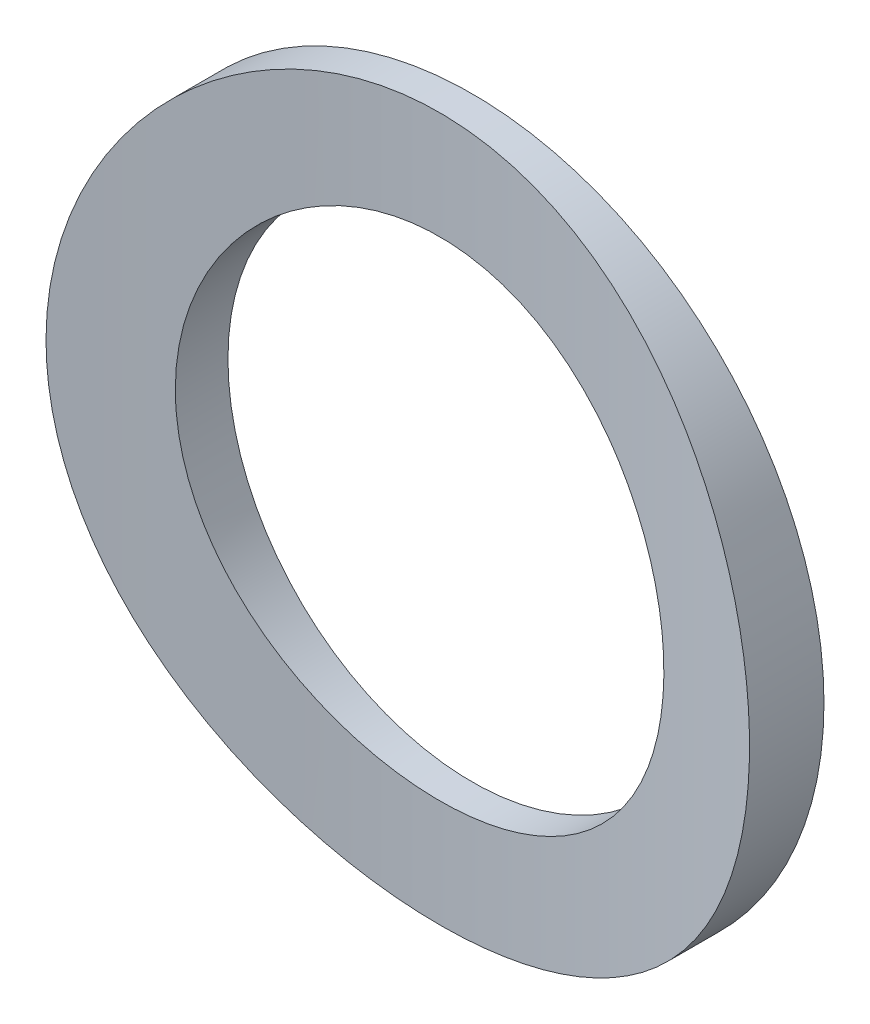
ISO-10303-21;
HEADER;
FILE_DESCRIPTION(('STEP AP214'),'2;1');
FILE_NAME('part.step','',(''),(''),'','','');
FILE_SCHEMA(('AUTOMOTIVE_DESIGN { 1 0 10303 214 1 1 1 1 }'));
ENDSEC;
DATA;
#1=APPLICATION_CONTEXT('core data for automotive mechanical design processes');
#2=APPLICATION_PROTOCOL_DEFINITION('international standard','automotive_design',2000,#1);
#3=PRODUCT_CONTEXT('',#1,'mechanical');
#4=PRODUCT('Part','Part','',(#3));
#5=PRODUCT_RELATED_PRODUCT_CATEGORY('part','',(#4));
#6=PRODUCT_DEFINITION_FORMATION('','',#4);
#7=PRODUCT_DEFINITION_CONTEXT('part definition',#1,'design');
#8=PRODUCT_DEFINITION('design','',#6,#7);
#9=PRODUCT_DEFINITION_SHAPE('','',#8);
#10=(LENGTH_UNIT() NAMED_UNIT(*) SI_UNIT(.MILLI.,.METRE.));
#11=(NAMED_UNIT(*) PLANE_ANGLE_UNIT() SI_UNIT($,.RADIAN.));
#12=(NAMED_UNIT(*) SI_UNIT($,.STERADIAN.) SOLID_ANGLE_UNIT());
#13=UNCERTAINTY_MEASURE_WITH_UNIT(LENGTH_MEASURE(1.E-05),#10,'distance_accuracy_value','');
#14=(GEOMETRIC_REPRESENTATION_CONTEXT(3) GLOBAL_UNCERTAINTY_ASSIGNED_CONTEXT((#13)) GLOBAL_UNIT_ASSIGNED_CONTEXT((#10,
#11,#12)) REPRESENTATION_CONTEXT('',''));
#15=CARTESIAN_POINT('',(0.,0.,0.));
#16=DIRECTION('',(0.,0.,1.));
#17=DIRECTION('',(1.,0.,0.));
#18=AXIS2_PLACEMENT_3D('',#15,#16,#17);
#19=CARTESIAN_POINT('',(0.,0.,0.));
#20=DIRECTION('',(0.,0.,1.));
#21=DIRECTION('',(1.,0.,0.));
#22=AXIS2_PLACEMENT_3D('',#19,#20,#21);
#23=PLANE('',#22);
#24=CARTESIAN_POINT('',(0.,0.,0.));
#25=DIRECTION('',(0.,0.,1.));
#26=DIRECTION('',(1.,0.,0.));
#27=AXIS2_PLACEMENT_3D('',#24,#25,#26);
#28=CIRCLE('',#27,10.8);
#29=CARTESIAN_POINT('',(10.8,0.,0.));
#30=VERTEX_POINT('',#29);
#31=EDGE_CURVE('E10',#30,#30,#28,.T.);
#32=ORIENTED_EDGE('',*,*,#31,.F.);
#33=EDGE_LOOP('',(#32));
#34=FACE_BOUND('',#33,.T.);
#35=CARTESIAN_POINT('',(0.,0.,0.));
#36=DIRECTION('',(0.,0.,1.));
#37=DIRECTION('',(1.,0.,0.));
#38=AXIS2_PLACEMENT_3D('',#35,#36,#37);
#39=CIRCLE('',#38,7.5);
#40=CARTESIAN_POINT('',(7.5,0.,0.));
#41=VERTEX_POINT('',#40);
#42=EDGE_CURVE('E45',#41,#41,#39,.T.);
#43=ORIENTED_EDGE('',*,*,#42,.T.);
#44=EDGE_LOOP('',(#43));
#45=FACE_BOUND('',#44,.T.);
#46=ADVANCED_FACE('F31',(#34,#45),#23,.F.);
#47=CARTESIAN_POINT('',(0.,0.,30.));
#48=DIRECTION('',(0.,0.,-1.));
#49=DIRECTION('',(-1.,0.,0.));
#50=AXIS2_PLACEMENT_3D('',#47,#48,#49);
#51=CYLINDRICAL_SURFACE('',#50,10.8);
#52=CARTESIAN_POINT('',(-10.8,0.,2.2857964400572));
#53=CARTESIAN_POINT('',(-10.8000079348904,0.298897883390443,2.28580147696791));
#54=CARTESIAN_POINT('',(-10.787589297866,0.597705643253308,2.28279419854576));
#55=CARTESIAN_POINT('',(-10.7380359438143,1.19323208256498,2.27086737453691));
#56=CARTESIAN_POINT('',(-10.7008979486276,1.48995047965788,2.26194704479118));
#57=CARTESIAN_POINT('',(-10.6021773806309,2.07922051289475,2.23844970755461));
#58=CARTESIAN_POINT('',(-10.5405811309029,2.37176972267526,2.22386953521398));
#59=CARTESIAN_POINT('',(-10.3934504461993,2.95047810400952,2.18948903898965));
#60=CARTESIAN_POINT('',(-10.307915451825,3.23663712606915,2.16968859311967));
#61=CARTESIAN_POINT('',(-10.1137056622972,3.80022234343822,2.12547658113236));
#62=CARTESIAN_POINT('',(-10.0050594997074,4.07765886136105,2.1010707248716));
#63=CARTESIAN_POINT('',(-9.76539019787415,4.62230198656379,2.04833484883984));
#64=CARTESIAN_POINT('',(-9.63436691237351,4.88950852696646,2.02000480342051));
#65=CARTESIAN_POINT('',(-9.35092269535112,5.41188839351881,1.96022637568066));
#66=CARTESIAN_POINT('',(-9.19850559989239,5.66706386599096,1.92877855269618));
#67=CARTESIAN_POINT('',(-8.87326603103885,6.16387312695061,1.86362160049846));
#68=CARTESIAN_POINT('',(-8.70043681396875,6.40550240100078,1.82991172555482));
#69=CARTESIAN_POINT('',(-8.33240756997788,6.87765379745953,1.76056321132295));
#70=CARTESIAN_POINT('',(-8.13687167598309,7.10791076172875,1.72490126658147));
#71=CARTESIAN_POINT('',(-7.72724073528579,7.55121395302377,1.65319223497588));
#72=CARTESIAN_POINT('',(-7.51314551381978,7.76426001794701,1.61714514448786));
#73=CARTESIAN_POINT('',(-7.06775447471977,8.17177950037807,1.54565236871448));
#74=CARTESIAN_POINT('',(-6.83645418333164,8.36624805702403,1.51020684281454));
#75=CARTESIAN_POINT('',(-6.35830763388531,8.73516301335203,1.44091474231895));
#76=CARTESIAN_POINT('',(-6.11146685641975,8.90961641110752,1.40706761131307));
#77=CARTESIAN_POINT('',(-5.60063696426517,9.23939563043546,1.34148509152117));
#78=CARTESIAN_POINT('',(-5.33647291015651,9.39445690488543,1.30978116078042));
#79=CARTESIAN_POINT('',(-4.79561374198786,9.68172772604707,1.24985127612633));
#80=CARTESIAN_POINT('',(-4.51891849445694,9.81393702928794,1.22162535926956));
#81=CARTESIAN_POINT('',(-3.95496853796437,10.0544609575956,1.16946001636018));
#82=CARTESIAN_POINT('',(-3.66771489022003,10.162777976439,1.14552016093083));
#83=CARTESIAN_POINT('',(-3.08469303131149,10.3546533262717,1.1026134424552));
#84=CARTESIAN_POINT('',(-2.78892499369587,10.438212161515,1.08364647812616));
#85=CARTESIAN_POINT('',(-2.19642778756125,10.5785974922,1.05152735565987));
#86=CARTESIAN_POINT('',(-1.89981128647784,10.6358771519216,1.03827688068143));
#87=CARTESIAN_POINT('',(-1.30262597163604,10.7254054782935,1.01747699370127));
#88=CARTESIAN_POINT('',(-1.00205720066141,10.7576544156776,1.00992752003718));
#89=CARTESIAN_POINT('',(-0.399218519880045,10.7968445661165,1.00074469482756));
#90=CARTESIAN_POINT('',(-0.0969488085294945,10.8037886726984,0.999110666869673));
#91=CARTESIAN_POINT('',(0.50708053326474,10.792317271856,1.00180351175685));
#92=CARTESIAN_POINT('',(0.808840169222417,10.7739020403482,1.00613031974639));
#93=CARTESIAN_POINT('',(1.40371504147369,10.7124804924835,1.02047877995066));
#94=CARTESIAN_POINT('',(1.69688372184964,10.6699637290406,1.03038703675553));
#95=CARTESIAN_POINT('',(2.27851373803457,10.5610563838975,1.05554322941121));
#96=CARTESIAN_POINT('',(2.56697514575459,10.4946661672598,1.07079108361115));
#97=CARTESIAN_POINT('',(3.13720403552641,10.3385366558586,1.10621430224707));
#98=CARTESIAN_POINT('',(3.41897130825994,10.2487966320182,1.12638982054378));
#99=CARTESIAN_POINT('',(3.97389748348405,10.0466583032164,1.17112661969368));
#100=CARTESIAN_POINT('',(4.24705627577316,9.93425970832755,1.19568795666513));
#101=CARTESIAN_POINT('',(4.78510215230457,9.68665055870229,1.24875449007061));
#102=CARTESIAN_POINT('',(5.04990560583657,9.55126474354788,1.27728965839973));
#103=CARTESIAN_POINT('',(5.56728817700932,9.25924285703944,1.33739863234597));
#104=CARTESIAN_POINT('',(5.81986270564155,9.10259889096358,1.36897356558034));
#105=CARTESIAN_POINT('',(6.31099048336028,8.76923372111058,1.43430280375228));
#106=CARTESIAN_POINT('',(6.54954757931241,8.59251806511135,1.4680565053742));
#107=CARTESIAN_POINT('',(7.0113048083122,8.22007490986436,1.5368706470007));
#108=CARTESIAN_POINT('',(7.23449784469013,8.02433872435878,1.57193167948743));
#109=CARTESIAN_POINT('',(7.66913966242494,7.61029076799974,1.6432589268434));
#110=CARTESIAN_POINT('',(7.88017906600458,7.39155054029268,1.67953389306906));
#111=CARTESIAN_POINT('',(8.28303644185429,6.93710831050676,1.7514290995454));
#112=CARTESIAN_POINT('',(8.47486277799297,6.70141376646509,1.78704961912812));
#113=CARTESIAN_POINT('',(8.83816714487617,6.21442902088875,1.85666119720481));
#114=CARTESIAN_POINT('',(9.00963570506795,5.96313164297282,1.890651492961));
#115=CARTESIAN_POINT('',(9.33083886778479,5.44681982307208,1.9559958658641));
#116=CARTESIAN_POINT('',(9.48058193936604,5.18181078113422,1.98735096824896));
#117=CARTESIAN_POINT('',(9.7578699087228,4.63867657927332,2.04664450268356));
#118=CARTESIAN_POINT('',(9.8853220269759,4.36050244884045,2.07456851694283));
#119=CARTESIAN_POINT('',(10.1162857284831,3.79398632708808,2.12601229117645));
#120=CARTESIAN_POINT('',(10.219797184951,3.50564428193013,2.14953202782626));
#121=CARTESIAN_POINT('',(10.4020217823837,2.92090864177281,2.1914439842025));
#122=CARTESIAN_POINT('',(10.4807386973104,2.62451627957447,2.20983698421726));
#123=CARTESIAN_POINT('',(10.6127273869072,2.02582656308019,2.24092690202133));
#124=CARTESIAN_POINT('',(10.6659997446227,1.7235293442554,2.25362395032925));
#125=CARTESIAN_POINT('',(10.7456924719157,1.12243056692348,2.27269591168445));
#126=CARTESIAN_POINT('',(10.7727122256234,0.823712830931328,2.27921186142676));
#127=CARTESIAN_POINT('',(10.8018146337746,0.224996277083071,2.28623222869823));
#128=CARTESIAN_POINT('',(10.8038976753815,-0.0750025208111321,2.28673673956005));
#129=CARTESIAN_POINT('',(10.7831101202159,-0.674059848453695,2.28171908036263));
#130=CARTESIAN_POINT('',(10.7602413782459,-0.973118446435066,2.2761973582662));
#131=CARTESIAN_POINT('',(10.6897477979661,-1.56813406766055,2.25929591227724));
#132=CARTESIAN_POINT('',(10.6421230480279,-1.86409110197248,2.24791620929597));
#133=CARTESIAN_POINT('',(10.5233587811106,-2.44663929411389,2.2198416654271));
#134=CARTESIAN_POINT('',(10.4525594654696,-2.7333036374003,2.20322384329495));
#135=CARTESIAN_POINT('',(10.2878455135437,-3.29957306501266,2.16510987012455));
#136=CARTESIAN_POINT('',(10.1939311554081,-3.57917823423883,2.14361377778802));
#137=CARTESIAN_POINT('',(9.98371181674956,-4.12943539522953,2.09635767893457));
#138=CARTESIAN_POINT('',(9.86740879664262,-4.40008816846203,2.07059804577329));
#139=CARTESIAN_POINT('',(9.61321307780876,-4.93079450135214,2.01552443029171));
#140=CARTESIAN_POINT('',(9.47531272185893,-5.19084426039456,1.98620918818347));
#141=CARTESIAN_POINT('',(9.17634514058519,-5.70299275586839,1.92430382511087));
#142=CARTESIAN_POINT('',(9.01491762117901,-5.95487539048265,1.89166572674027));
#143=CARTESIAN_POINT('',(8.67186871847295,-6.44422090625039,1.82446202030532));
#144=CARTESIAN_POINT('',(8.49024694365112,-6.68168350769326,1.78989637487657));
#145=CARTESIAN_POINT('',(8.10797527124915,-7.14072653224069,1.71977806820931));
#146=CARTESIAN_POINT('',(7.90731982217269,-7.36230228838309,1.68422512115907));
#147=CARTESIAN_POINT('',(7.48841137379412,-7.7879934496522,1.61312077788698));
#148=CARTESIAN_POINT('',(7.27016422152014,-7.99211461012804,1.57756938504733));
#149=CARTESIAN_POINT('',(6.81243945021547,-8.38592912908216,1.50664376514044));
#150=CARTESIAN_POINT('',(6.57260061002799,-8.5752067189097,1.47129061004539));
#151=CARTESIAN_POINT('',(6.07755902043553,-8.93289030286369,1.402569005738));
#152=CARTESIAN_POINT('',(5.82235602144713,-9.10129595779954,1.3692005887843));
#153=CARTESIAN_POINT('',(5.29832573775091,-9.41600506616315,1.30538981837368));
#154=CARTESIAN_POINT('',(5.02949887317099,-9.56230920059653,1.2749473747704));
#155=CARTESIAN_POINT('',(4.48007155535076,-9.83171230772099,1.21785033893028));
#156=CARTESIAN_POINT('',(4.19947125947238,-9.95481159044395,1.19119569608713));
#157=CARTESIAN_POINT('',(3.63045913046437,-10.1760650575475,1.14260445821323));
#158=CARTESIAN_POINT('',(3.34211497953266,-10.2743863434846,1.12063642027863));
#159=CARTESIAN_POINT('',(2.75782948621577,-10.4463925394339,1.08181090256654));
#160=CARTESIAN_POINT('',(2.46188816031032,-10.5200775028821,1.06495341170432));
#161=CARTESIAN_POINT('',(1.86461820321248,-10.642184727078,1.03683473010502));
#162=CARTESIAN_POINT('',(1.56329033740125,-10.6906105478829,1.02557275073976));
#163=CARTESIAN_POINT('',(0.957458061086466,-10.7617978836126,1.00896727916091));
#164=CARTESIAN_POINT('',(0.652953711133972,-10.7845598868494,1.0036236743369));
#165=CARTESIAN_POINT('',(0.0503673570073762,-10.8039878296937,0.999064450843181));
#166=CARTESIAN_POINT('',(-0.247694027924374,-10.801265008298,0.999705297653567));
#167=CARTESIAN_POINT('',(-0.842500543345055,-10.7712053137785,1.00675429978942));
#168=CARTESIAN_POINT('',(-1.13924569616658,-10.7438688598935,1.0131623568832));
#169=CARTESIAN_POINT('',(-1.72928251436695,-10.6648103591939,1.03156837637475));
#170=CARTESIAN_POINT('',(-2.0225742791705,-10.6130890162002,1.04356617743566));
#171=CARTESIAN_POINT('',(-2.60363680989814,-10.4856827717355,1.07282173118239));
#172=CARTESIAN_POINT('',(-2.89140755162944,-10.4099977652827,1.09007950691149));
#173=CARTESIAN_POINT('',(-3.45821594537291,-10.2356381664116,1.12930008316078));
#174=CARTESIAN_POINT('',(-3.73728556812231,-10.1370628459711,1.1512425347169));
#175=CARTESIAN_POINT('',(-4.28608759552785,-9.91749980388009,1.19928674626065));
#176=CARTESIAN_POINT('',(-4.55582005170348,-9.79651220591677,1.22538848329422));
#177=CARTESIAN_POINT('',(-5.08415354162441,-9.53302242690622,1.28105486268218));
#178=CARTESIAN_POINT('',(-5.34275565059251,-9.39052233004862,1.31061916951123));
#179=CARTESIAN_POINT('',(-5.84729224932102,-9.08494323953151,1.37244467942348));
#180=CARTESIAN_POINT('',(-6.09322187304913,-8.92185642260782,1.40470690617546));
#181=CARTESIAN_POINT('',(-6.57580010696405,-8.57259757508947,1.47177303317069));
#182=CARTESIAN_POINT('',(-6.81214331031252,-8.38601098256789,1.50661620448808));
#183=CARTESIAN_POINT('',(-7.26845393463051,-7.99375645311585,1.57728631409388));
#184=CARTESIAN_POINT('',(-7.48841382806663,-7.78807984131565,1.61311369436787));
#185=CARTESIAN_POINT('',(-7.91045108507268,-7.35903075416762,1.68476417281462));
#186=CARTESIAN_POINT('',(-8.11252411020068,-7.13565401043417,1.72058726785534));
#187=CARTESIAN_POINT('',(-8.4972965756996,-6.67281646237891,1.79121539800791));
#188=CARTESIAN_POINT('',(-8.68000461675038,-6.43336287619903,1.8260208800619));
#189=CARTESIAN_POINT('',(-9.02773374411959,-5.9357933709069,1.89421388495958));
#190=CARTESIAN_POINT('',(-9.19241582828666,-5.67743588659212,1.92756881415396));
#191=CARTESIAN_POINT('',(-9.49932244368783,-5.14748537775199,1.99125157335925));
#192=CARTESIAN_POINT('',(-9.64155535208527,-4.87589734010222,2.021580530984));
#193=CARTESIAN_POINT('',(-9.90249218735348,-4.32139605670845,2.07830709003744));
#194=CARTESIAN_POINT('',(-10.0212077526502,-4.0384884965911,2.10470663446494));
#195=CARTESIAN_POINT('',(-10.2342262869301,-3.46333740441969,2.15278731688828));
#196=CARTESIAN_POINT('',(-10.3285333119519,-3.171095432571,2.17446923872973));
#197=CARTESIAN_POINT('',(-10.5391854337567,-2.40829000212269,2.22340506493482));
#198=CARTESIAN_POINT('',(-10.6368322592043,-1.93216144822495,2.24665172146838));
#199=CARTESIAN_POINT('',(-10.7672309889223,-0.970609034594352,2.27784282264485));
#200=CARTESIAN_POINT('',(-10.7999871196947,-0.485185782329208,2.28578826389537));
#201=CARTESIAN_POINT('',(-10.8,0.,2.2857964400572));
#202=B_SPLINE_CURVE_WITH_KNOTS('',3,(#52,#53,#54,#55,#56,#57,#58,#59,#60,#61,#62,#63,#64,#65,
#66,#67,#68,#69,#70,#71,#72,#73,#74,#75,#76,#77,#78,#79,#80,#81,#82,#83,#84,#85,#86,#87,#88,#89,
#90,#91,#92,#93,#94,#95,#96,#97,#98,#99,#100,#101,#102,#103,#104,#105,#106,#107,#108,#109,#110,
#111,#112,#113,#114,#115,#116,#117,#118,#119,#120,#121,#122,#123,#124,#125,#126,#127,#128,#129,
#130,#131,#132,#133,#134,#135,#136,#137,#138,#139,#140,#141,#142,#143,#144,#145,#146,#147,#148,
#149,#150,#151,#152,#153,#154,#155,#156,#157,#158,#159,#160,#161,#162,#163,#164,#165,#166,#167,
#168,#169,#170,#171,#172,#173,#174,#175,#176,#177,#178,#179,#180,#181,#182,#183,#184,#185,#186,
#187,#188,#189,#190,#191,#192,#193,#194,#195,#196,#197,#198,#199,#200,#201),.UNSPECIFIED.,.T.,
.F.,(4,2,2,2,2,2,2,2,2,2,2,2,2,2,2,2,2,2,2,2,2,2,2,2,2,2,2,2,2,2,2,2,2,2,2,2,2,2,2,2,2,2,2,2,2,
2,2,2,2,2,2,2,2,2,2,2,2,2,2,2,2,2,2,2,2,2,2,2,2,2,2,2,2,2,4),(0.,0.896265738925422,
1.79265035987757,2.68953694155911,3.58644448336084,4.48224724624561,5.37805586433193,
6.27370406223544,7.16964899292306,8.08112538332063,8.99261035754788,9.90433317510312,
10.8157362413432,11.738461733471,12.6611970559479,13.5838398872042,14.5064639255549,
15.4125174678913,16.3185612101597,17.2245013459446,18.130431624931,19.0185880174809,
19.9067308293101,20.7949013759391,21.6830832878701,22.578368890439,23.4739878932161,
24.36935994821,25.265142838964,26.1823828755682,27.0992218660278,28.0164857176794,
28.9333910341198,29.8540262943536,30.7746664300242,31.6951663678331,32.6156452119767,
33.5145766350779,34.4134941014939,35.3123447510155,36.2111921919287,37.0973957230458,
37.9835885907685,38.869703896146,39.7561340832822,40.6579370836805,41.5597575710942,
42.4618419034017,43.3636276328215,44.2852357866114,45.2068589155273,46.1284536410306,
47.0500360525575,47.9652261929206,48.8804143482283,49.795473480826,50.7105152020622,
51.6036674857289,52.4968045568064,53.3899158508522,54.2830310575628,55.1723429977193,
56.0616500301551,56.9508709593242,57.8404308289252,58.7487643538626,59.6575126828766,
60.566480827345,61.4750435598686,62.3984988527531,63.3216087289674,64.2442606225893,
65.1667590978663,66.6217166065587,68.0765793469126),.UNSPECIFIED.);
#203=CARTESIAN_POINT('',(-10.8,0.,2.2857964400572));
#204=VERTEX_POINT('',#203);
#205=EDGE_CURVE('E49',#204,#204,#202,.T.);
#206=ORIENTED_EDGE('',*,*,#205,.T.);
#207=EDGE_LOOP('',(#206));
#208=FACE_BOUND('',#207,.T.);
#209=ORIENTED_EDGE('',*,*,#31,.T.);
#210=EDGE_LOOP('',(#209));
#211=FACE_BOUND('',#210,.T.);
#212=ADVANCED_FACE('F33',(#208,#211),#51,.T.);
#213=CARTESIAN_POINT('',(0.,0.,30.));
#214=DIRECTION('',(0.,0.,-1.));
#215=DIRECTION('',(-1.,0.,0.));
#216=AXIS2_PLACEMENT_3D('',#213,#214,#215);
#217=CYLINDRICAL_SURFACE('',#216,7.5);
#218=CARTESIAN_POINT('',(-7.5,0.,1.61553129098015));
#219=CARTESIAN_POINT('',(-7.50000314270832,0.209203591155485,1.61553269593937));
#220=CARTESIAN_POINT('',(-7.49124400386747,0.418364368174491,1.61408195441003));
#221=CARTESIAN_POINT('',(-7.45627943199336,0.83524766424762,1.60832420687435));
#222=CARTESIAN_POINT('',(-7.4300704930775,1.04296988580249,1.6040166268942));
#223=CARTESIAN_POINT('',(-7.36037890728437,1.45555098942725,1.59266511586835));
#224=CARTESIAN_POINT('',(-7.31688513827255,1.66040793976998,1.58561942301523));
#225=CARTESIAN_POINT('',(-7.21293794430922,2.06574841673567,1.56899411628626));
#226=CARTESIAN_POINT('',(-7.15247829325185,2.26623030864357,1.55941357224963));
#227=CARTESIAN_POINT('',(-7.01514243968989,2.66109379546087,1.53800933124272));
#228=CARTESIAN_POINT('',(-6.93828602429413,2.85548242209558,1.52618833987731));
#229=CARTESIAN_POINT('',(-6.76864684283367,3.23713535535738,1.50062884574463));
#230=CARTESIAN_POINT('',(-6.67585820690534,3.42439700503701,1.48688963660364));
#231=CARTESIAN_POINT('',(-6.47509185605301,3.79034571054106,1.45789353056483));
#232=CARTESIAN_POINT('',(-6.3671217520456,3.96903700310379,1.44263739526223));
#233=CARTESIAN_POINT('',(-6.13667486800417,4.31679850642258,1.4110238407181));
#234=CARTESIAN_POINT('',(-6.01419269605783,4.4858651063965,1.39466601312667));
#235=CARTESIAN_POINT('',(-5.7545547761164,4.81448896054335,1.3611748097087));
#236=CARTESIAN_POINT('',(-5.61728844629325,4.97395832626037,1.3440362347617));
#237=CARTESIAN_POINT('',(-5.32980510636755,5.28085238655282,1.30958374528261));
#238=CARTESIAN_POINT('',(-5.17958332051975,5.42827260013206,1.29226976818588));
#239=CARTESIAN_POINT('',(-4.86731318760853,5.70994406858791,1.25796330663985));
#240=CARTESIAN_POINT('',(-4.70526850286208,5.84419937153775,1.24097072467024));
#241=CARTESIAN_POINT('',(-4.37035990983034,6.09870517135764,1.20777057881614));
#242=CARTESIAN_POINT('',(-4.19749203474101,6.21895048668895,1.19156330666174));
#243=CARTESIAN_POINT('',(-3.84119374557066,6.4451535981667,1.16030778812468));
#244=CARTESIAN_POINT('',(-3.65771016557798,6.55102863214255,1.14526645321274));
#245=CARTESIAN_POINT('',(-3.28234052542427,6.74692972266968,1.11686951884841));
#246=CARTESIAN_POINT('',(-3.09045439385032,6.83695564448738,1.10351393372688));
#247=CARTESIAN_POINT('',(-2.6996495139615,7.00048258436236,1.07886958241701));
#248=CARTESIAN_POINT('',(-2.50073119991745,7.07398462079259,1.06758068886569));
#249=CARTESIAN_POINT('',(-2.09727113205832,7.2039134932559,1.04739128939826));
#250=CARTESIAN_POINT('',(-1.89272930123604,7.2603400953346,1.03849081620662));
#251=CARTESIAN_POINT('',(-1.48137229373085,7.35524891525879,1.02340260114612));
#252=CARTESIAN_POINT('',(-1.2745942987089,7.39388849839648,1.0171910998349));
#253=CARTESIAN_POINT('',(-0.858390989309888,7.45368281045017,1.00753845330513));
#254=CARTESIAN_POINT('',(-0.648964785447227,7.47483149709347,1.00409826545418));
#255=CARTESIAN_POINT('',(-0.229121699271781,7.49944525183096,1.0000922421033));
#256=CARTESIAN_POINT('',(-0.0187052689064493,7.50291772695284,0.999525202641678));
#257=CARTESIAN_POINT('',(0.401685825657939,7.49219234102952,1.00127194212361));
#258=CARTESIAN_POINT('',(0.611660298842092,7.4779879783257,1.00358678104134));
#259=CARTESIAN_POINT('',(1.23449681603854,7.40938040262887,1.01471520234202));
#260=CARTESIAN_POINT('',(1.64476302004363,7.32923806838659,1.02767217841432));
#261=CARTESIAN_POINT('',(2.44571626623305,7.10225455106776,1.06330770244933));
#262=CARTESIAN_POINT('',(2.83640273199952,6.95541140563135,1.08598653643119));
#263=CARTESIAN_POINT('',(3.58938367071933,6.59852793117505,1.13869394970982));
#264=CARTESIAN_POINT('',(3.95154563592414,6.38821233991433,1.16875443315696));
#265=CARTESIAN_POINT('',(4.63567148728744,5.91055597604594,1.23288476179991));
#266=CARTESIAN_POINT('',(4.95763225369402,5.64321078209898,1.2669549177621));
#267=CARTESIAN_POINT('',(5.55616317368816,5.05539326213045,1.33577968693513));
#268=CARTESIAN_POINT('',(5.83216281497398,4.73434005117996,1.37053765404525));
#269=CARTESIAN_POINT('',(6.32646337762187,4.0501809436611,1.43643734273293));
#270=CARTESIAN_POINT('',(6.54476381013086,3.68707469083834,1.46757903367055));
#271=CARTESIAN_POINT('',(6.91757498478104,2.92847020882068,1.52272129328031));
#272=CARTESIAN_POINT('',(7.07201930503424,2.53293876128635,1.54671441894446));
#273=CARTESIAN_POINT('',(7.31211837446542,1.72106913986036,1.58471794868258));
#274=CARTESIAN_POINT('',(7.39777890451083,1.30473271762744,1.59872919166311));
#275=CARTESIAN_POINT('',(7.49708056126982,0.468170189834351,1.61502096298469));
#276=CARTESIAN_POINT('',(7.51153400475474,0.0480429979982741,1.61743379600686));
#277=CARTESIAN_POINT('',(7.47017255664583,-0.788629596039063,1.61060760162799));
#278=CARTESIAN_POINT('',(7.41436025756876,-1.20517512981786,1.60136900411676));
#279=CARTESIAN_POINT('',(7.23474800925542,-2.02029117656747,1.57240334876458));
#280=CARTESIAN_POINT('',(7.11135953261033,-2.41895483439239,1.55273979162643));
#281=CARTESIAN_POINT('',(6.8005111963015,-3.18995351041522,1.50519154363421));
#282=CARTESIAN_POINT('',(6.61304765268423,-3.56228701329248,1.477306380097));
#283=CARTESIAN_POINT('',(6.17750928146746,-4.27363467884362,1.41615348533587));
#284=CARTESIAN_POINT('',(5.92891315028116,-4.61232509835631,1.38284033857674));
#285=CARTESIAN_POINT('',(5.37864469849968,-5.24359370532491,1.31470002570909));
#286=CARTESIAN_POINT('',(5.07696881130314,-5.53616879163564,1.27987275798033));
#287=CARTESIAN_POINT('',(4.58967625796418,-5.93546853436819,1.22924451753138));
#288=CARTESIAN_POINT('',(4.42043567568078,-6.0625536275392,1.21255123458418));
#289=CARTESIAN_POINT('',(4.07177446436001,-6.30200730247823,1.18023088941022));
#290=CARTESIAN_POINT('',(3.89235761659291,-6.41438129987356,1.16460343583803));
#291=CARTESIAN_POINT('',(3.52452004123565,-6.62363717801326,1.13485171368449));
#292=CARTESIAN_POINT('',(3.33609623598548,-6.72051371344213,1.12072796431348));
#293=CARTESIAN_POINT('',(2.95168381647641,-6.89799655837674,1.09439407626888));
#294=CARTESIAN_POINT('',(2.75569795577491,-6.97860872482408,1.08218324909065));
#295=CARTESIAN_POINT('',(2.35830222306573,-7.12270337330776,1.06006257173294));
#296=CARTESIAN_POINT('',(2.15691753901028,-7.1862539225379,1.05014360098519));
#297=CARTESIAN_POINT('',(1.74940902268697,-7.29617034943649,1.03282526335565));
#298=CARTESIAN_POINT('',(1.54328530287832,-7.34253663444831,1.02542583674981));
#299=CARTESIAN_POINT('',(1.12779310662451,-7.41772556276482,1.01335766334219));
#300=CARTESIAN_POINT('',(0.918424783936963,-7.44654903480997,1.0086887875468));
#301=CARTESIAN_POINT('',(0.497962646583866,-7.48642945733044,1.00221486594633));
#302=CARTESIAN_POINT('',(0.286868873325714,-7.49748683290611,1.00040975161829));
#303=CARTESIAN_POINT('',(-0.133089507030294,-7.50172506966356,0.999718739415203));
#304=CARTESIAN_POINT('',(-0.341952042009412,-7.49510863250047,1.00079974049701));
#305=CARTESIAN_POINT('',(-0.758290568226946,-7.46448582070233,1.00577948277632));
#306=CARTESIAN_POINT('',(-0.965767022697688,-7.44048558285195,1.00967722961237));
#307=CARTESIAN_POINT('',(-1.3779651488542,-7.3752803274751,1.0201813139479));
#308=CARTESIAN_POINT('',(-1.58268633264449,-7.33407230316491,1.02678812480907));
#309=CARTESIAN_POINT('',(-1.98788529030309,-7.2347649285913,1.04252593036949));
#310=CARTESIAN_POINT('',(-2.18836314894424,-7.17666591611714,1.05165687459045));
#311=CARTESIAN_POINT('',(-2.5834751381766,-7.04407806602007,1.07217886397862));
#312=CARTESIAN_POINT('',(-2.77811501281129,-6.96960598222077,1.08356759768959));
#313=CARTESIAN_POINT('',(-3.16041977055325,-6.8047834643851,1.10829657204597));
#314=CARTESIAN_POINT('',(-3.34808469617821,-6.71443312715814,1.12163680079306));
#315=CARTESIAN_POINT('',(-3.71520032291209,-6.51848056338254,1.14990521148634));
#316=CARTESIAN_POINT('',(-3.89464926840347,-6.41287509691472,1.16483373057935));
#317=CARTESIAN_POINT('',(-4.24401635524091,-6.18720910404296,1.1958618096672));
#318=CARTESIAN_POINT('',(-4.41393782627924,-6.06715367439953,1.21196095597233));
#319=CARTESIAN_POINT('',(-4.74505109752168,-5.81194256438041,1.24508232132263));
#320=CARTESIAN_POINT('',(-4.9061218193766,-5.6766308569429,1.26211294804424));
#321=CARTESIAN_POINT('',(-5.2162610992049,-5.39302876089243,1.2964447839659));
#322=CARTESIAN_POINT('',(-5.36533392905818,-5.24474303131301,1.31374589421583));
#323=CARTESIAN_POINT('',(-5.65060476951725,-4.93607690641592,1.34815091434292));
#324=CARTESIAN_POINT('',(-5.78679500436291,-4.77568931023563,1.36525469971816));
#325=CARTESIAN_POINT('',(-6.04520657248086,-4.44405790382782,1.39876698752199));
#326=CARTESIAN_POINT('',(-6.16743303935457,-4.27281811949886,1.415175744064));
#327=CARTESIAN_POINT('',(-6.39793512228911,-3.91934430451446,1.44695329255124));
#328=CARTESIAN_POINT('',(-6.50610507434614,-3.73704060063349,1.4623138369353));
#329=CARTESIAN_POINT('',(-6.70663927819007,-3.36390206064926,1.49141558223837));
#330=CARTESIAN_POINT('',(-6.79900934401409,-3.173070395407,1.50515737824188));
#331=CARTESIAN_POINT('',(-6.96724869466368,-2.78428972857265,1.53061811782517));
#332=CARTESIAN_POINT('',(-7.04312961267968,-2.58634586033048,1.54233848632164));
#333=CARTESIAN_POINT('',(-7.1778808976427,-2.18469805676029,1.56342154174631));
#334=CARTESIAN_POINT('',(-7.23675495711878,-1.98099538234498,1.57278474040641));
#335=CARTESIAN_POINT('',(-7.35755398813605,-1.48506850694633,1.59216345921802));
#336=CARTESIAN_POINT('',(-7.41090851079692,-1.19066227280097,1.60088419074073));
#337=CARTESIAN_POINT('',(-7.48212897349709,-0.597474884014678,1.61256705501311));
#338=CARTESIAN_POINT('',(-7.49999551294747,-0.298693803353132,1.61552928502696));
#339=CARTESIAN_POINT('',(-7.5,0.,1.61553129098015));
#340=B_SPLINE_CURVE_WITH_KNOTS('',3,(#218,#219,#220,#221,#222,#223,#224,#225,#226,#227,#228,
#229,#230,#231,#232,#233,#234,#235,#236,#237,#238,#239,#240,#241,#242,#243,#244,#245,#246,#247,
#248,#249,#250,#251,#252,#253,#254,#255,#256,#257,#258,#259,#260,#261,#262,#263,#264,#265,#266,
#267,#268,#269,#270,#271,#272,#273,#274,#275,#276,#277,#278,#279,#280,#281,#282,#283,#284,#285,
#286,#287,#288,#289,#290,#291,#292,#293,#294,#295,#296,#297,#298,#299,#300,#301,#302,#303,#304,
#305,#306,#307,#308,#309,#310,#311,#312,#313,#314,#315,#316,#317,#318,#319,#320,#321,#322,#323,
#324,#325,#326,#327,#328,#329,#330,#331,#332,#333,#334,#335,#336,#337,#338,#339),.UNSPECIFIED.,
.T.,.F.,(4,2,2,2,2,2,2,2,2,2,2,2,2,2,2,2,2,2,2,2,2,2,2,2,2,2,2,2,2,2,2,2,2,2,2,2,2,2,2,2,2,2,2,
2,2,2,2,2,2,2,2,2,2,2,2,2,2,2,2,2,4),(0.,0.627348877076565,1.25482383442136,1.88270320361387,
2.51081329274806,3.1381696427516,3.76575762581064,4.39303209496232,5.02054036112635,
5.65311967283107,6.28593317600585,6.91855148138685,7.55140302040296,8.18775726664704,
8.82411692228815,9.46043734809849,10.0967664918839,10.7273522686467,11.3581557919164,
11.9886949619331,12.6194661170133,13.8676853704811,15.1159413493495,16.3696904110084,
17.6235367075356,18.8919432313497,20.1603605013175,21.4300938549826,22.699720483958,
23.9548293710033,25.2098919510524,26.4573960514733,27.7049718883842,28.9635795462869,
30.2222718064483,30.8585511799912,31.4945956559811,32.1308590427761,32.7668928949957,
33.4003502614628,34.0337926112174,34.6672050341837,35.3006023008744,35.9267663891529,
36.5527095382601,37.1787621066546,37.8048021559893,38.4302045638845,39.0556031588452,
39.6811347732049,40.3064463944128,40.9388606114957,41.5710486504694,42.2036158667779,
42.8359497743165,43.4727914499226,44.1093982742161,44.7455544999062,45.3815724993647,
46.2772951119912,47.1730025952535),.UNSPECIFIED.);
#341=CARTESIAN_POINT('',(-7.5,0.,1.61553129098015));
#342=VERTEX_POINT('',#341);
#343=EDGE_CURVE('E36',#342,#342,#340,.T.);
#344=ORIENTED_EDGE('',*,*,#343,.F.);
#345=EDGE_LOOP('',(#344));
#346=FACE_BOUND('',#345,.T.);
#347=ORIENTED_EDGE('',*,*,#42,.F.);
#348=EDGE_LOOP('',(#347));
#349=FACE_BOUND('',#348,.T.);
#350=ADVANCED_FACE('F59',(#346,#349),#217,.F.);
#351=CARTESIAN_POINT('',(0.,-10.8,47.));
#352=DIRECTION('',(0.,1.,0.));
#353=DIRECTION('',(0.,0.,1.));
#354=AXIS2_PLACEMENT_3D('',#351,#352,#353);
#355=CYLINDRICAL_SURFACE('',#354,46.);
#356=ORIENTED_EDGE('',*,*,#343,.T.);
#357=EDGE_LOOP('',(#356));
#358=FACE_BOUND('',#357,.T.);
#359=ORIENTED_EDGE('',*,*,#205,.F.);
#360=EDGE_LOOP('',(#359));
#361=FACE_BOUND('',#360,.T.);
#362=ADVANCED_FACE('F56',(#358,#361),#355,.F.);
#363=CLOSED_SHELL('',(#46,#212,#350,#362));
#364=MANIFOLD_SOLID_BREP('B2',#363);
#365=ADVANCED_BREP_SHAPE_REPRESENTATION('',(#18,#364),#14);
#366=SHAPE_DEFINITION_REPRESENTATION(#9,#365);
ENDSEC;
END-ISO-10303-21;
